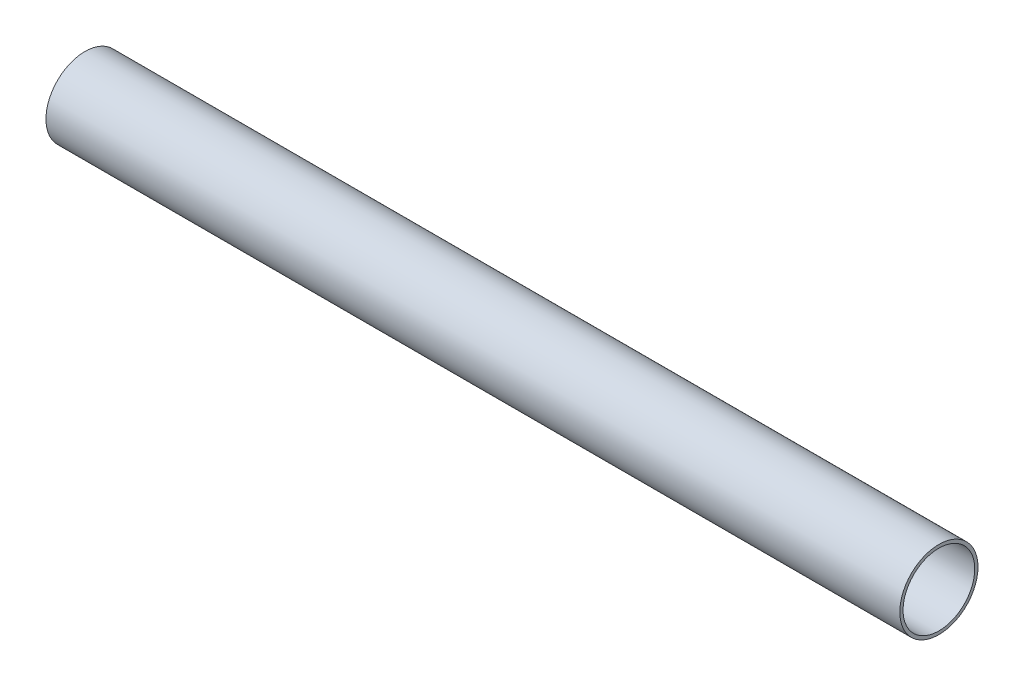
ISO-10303-21;
HEADER;
FILE_DESCRIPTION(('STEP AP214'),'2;1');
FILE_NAME('part.step','',(''),(''),'','','');
FILE_SCHEMA(('AUTOMOTIVE_DESIGN { 1 0 10303 214 1 1 1 1 }'));
ENDSEC;
DATA;
#1=APPLICATION_CONTEXT('core data for automotive mechanical design processes');
#2=APPLICATION_PROTOCOL_DEFINITION('international standard','automotive_design',2000,#1);
#3=PRODUCT_CONTEXT('',#1,'mechanical');
#4=PRODUCT('Part','Part','',(#3));
#5=PRODUCT_RELATED_PRODUCT_CATEGORY('part','',(#4));
#6=PRODUCT_DEFINITION_FORMATION('','',#4);
#7=PRODUCT_DEFINITION_CONTEXT('part definition',#1,'design');
#8=PRODUCT_DEFINITION('design','',#6,#7);
#9=PRODUCT_DEFINITION_SHAPE('','',#8);
#10=(LENGTH_UNIT() NAMED_UNIT(*) SI_UNIT(.MILLI.,.METRE.));
#11=(NAMED_UNIT(*) PLANE_ANGLE_UNIT() SI_UNIT($,.RADIAN.));
#12=(NAMED_UNIT(*) SI_UNIT($,.STERADIAN.) SOLID_ANGLE_UNIT());
#13=UNCERTAINTY_MEASURE_WITH_UNIT(LENGTH_MEASURE(1.E-05),#10,'distance_accuracy_value','');
#14=(GEOMETRIC_REPRESENTATION_CONTEXT(3) GLOBAL_UNCERTAINTY_ASSIGNED_CONTEXT((#13)) GLOBAL_UNIT_ASSIGNED_CONTEXT((#10,
#11,#12)) REPRESENTATION_CONTEXT('',''));
#15=CARTESIAN_POINT('',(0.,0.,0.));
#16=DIRECTION('',(0.,0.,1.));
#17=DIRECTION('',(1.,0.,0.));
#18=AXIS2_PLACEMENT_3D('',#15,#16,#17);
#19=CARTESIAN_POINT('',(415.9758,0.,0.));
#20=DIRECTION('',(1.,0.,0.));
#21=DIRECTION('',(0.,0.,-1.));
#22=AXIS2_PLACEMENT_3D('',#19,#20,#21);
#23=PLANE('',#22);
#24=CARTESIAN_POINT('',(415.9758,0.,0.));
#25=DIRECTION('',(1.,0.,0.));
#26=DIRECTION('',(0.,0.,-1.));
#27=AXIS2_PLACEMENT_3D('',#24,#25,#26);
#28=CIRCLE('',#27,19.05);
#29=CARTESIAN_POINT('',(415.9758,0.,-19.05));
#30=VERTEX_POINT('',#29);
#31=EDGE_CURVE('E10',#30,#30,#28,.T.);
#32=ORIENTED_EDGE('',*,*,#31,.T.);
#33=EDGE_LOOP('',(#32));
#34=FACE_BOUND('',#33,.T.);
#35=CARTESIAN_POINT('',(415.9758,0.,0.));
#36=DIRECTION('',(1.,0.,0.));
#37=DIRECTION('',(0.,0.,-1.));
#38=AXIS2_PLACEMENT_3D('',#35,#36,#37);
#39=CIRCLE('',#38,17.4625);
#40=CARTESIAN_POINT('',(415.9758,0.,-17.4625));
#41=VERTEX_POINT('',#40);
#42=EDGE_CURVE('E44',#41,#41,#39,.T.);
#43=ORIENTED_EDGE('',*,*,#42,.F.);
#44=EDGE_LOOP('',(#43));
#45=FACE_BOUND('',#44,.T.);
#46=ADVANCED_FACE('F33',(#34,#45),#23,.T.);
#47=CARTESIAN_POINT('',(0.,0.,0.));
#48=DIRECTION('',(1.,0.,0.));
#49=DIRECTION('',(0.,0.,-1.));
#50=AXIS2_PLACEMENT_3D('',#47,#48,#49);
#51=PLANE('',#50);
#52=CARTESIAN_POINT('',(0.,0.,0.));
#53=DIRECTION('',(1.,0.,0.));
#54=DIRECTION('',(0.,0.,-1.));
#55=AXIS2_PLACEMENT_3D('',#52,#53,#54);
#56=CIRCLE('',#55,19.05);
#57=CARTESIAN_POINT('',(0.,0.,-19.05));
#58=VERTEX_POINT('',#57);
#59=EDGE_CURVE('E37',#58,#58,#56,.T.);
#60=ORIENTED_EDGE('',*,*,#59,.F.);
#61=EDGE_LOOP('',(#60));
#62=FACE_BOUND('',#61,.T.);
#63=CARTESIAN_POINT('',(0.,0.,0.));
#64=DIRECTION('',(1.,0.,0.));
#65=DIRECTION('',(0.,0.,-1.));
#66=AXIS2_PLACEMENT_3D('',#63,#64,#65);
#67=CIRCLE('',#66,17.4625);
#68=CARTESIAN_POINT('',(0.,0.,-17.4625));
#69=VERTEX_POINT('',#68);
#70=EDGE_CURVE('E46',#69,#69,#67,.T.);
#71=ORIENTED_EDGE('',*,*,#70,.T.);
#72=EDGE_LOOP('',(#71));
#73=FACE_BOUND('',#72,.T.);
#74=ADVANCED_FACE('F56',(#62,#73),#51,.F.);
#75=CARTESIAN_POINT('',(415.9758,0.,0.));
#76=DIRECTION('',(-1.,0.,0.));
#77=DIRECTION('',(0.,0.,1.));
#78=AXIS2_PLACEMENT_3D('',#75,#76,#77);
#79=CYLINDRICAL_SURFACE('',#78,19.05);
#80=ORIENTED_EDGE('',*,*,#31,.F.);
#81=EDGE_LOOP('',(#80));
#82=FACE_BOUND('',#81,.T.);
#83=ORIENTED_EDGE('',*,*,#59,.T.);
#84=EDGE_LOOP('',(#83));
#85=FACE_BOUND('',#84,.T.);
#86=ADVANCED_FACE('F35',(#82,#85),#79,.T.);
#87=CARTESIAN_POINT('',(415.9758,0.,0.));
#88=DIRECTION('',(-1.,0.,0.));
#89=DIRECTION('',(0.,0.,1.));
#90=AXIS2_PLACEMENT_3D('',#87,#88,#89);
#91=CYLINDRICAL_SURFACE('',#90,17.4625);
#92=ORIENTED_EDGE('',*,*,#42,.T.);
#93=EDGE_LOOP('',(#92));
#94=FACE_BOUND('',#93,.T.);
#95=ORIENTED_EDGE('',*,*,#70,.F.);
#96=EDGE_LOOP('',(#95));
#97=FACE_BOUND('',#96,.T.);
#98=ADVANCED_FACE('F52',(#94,#97),#91,.F.);
#99=CLOSED_SHELL('',(#46,#74,#86,#98));
#100=MANIFOLD_SOLID_BREP('B2',#99);
#101=ADVANCED_BREP_SHAPE_REPRESENTATION('',(#18,#100),#14);
#102=SHAPE_DEFINITION_REPRESENTATION(#9,#101);
ENDSEC;
END-ISO-10303-21;
